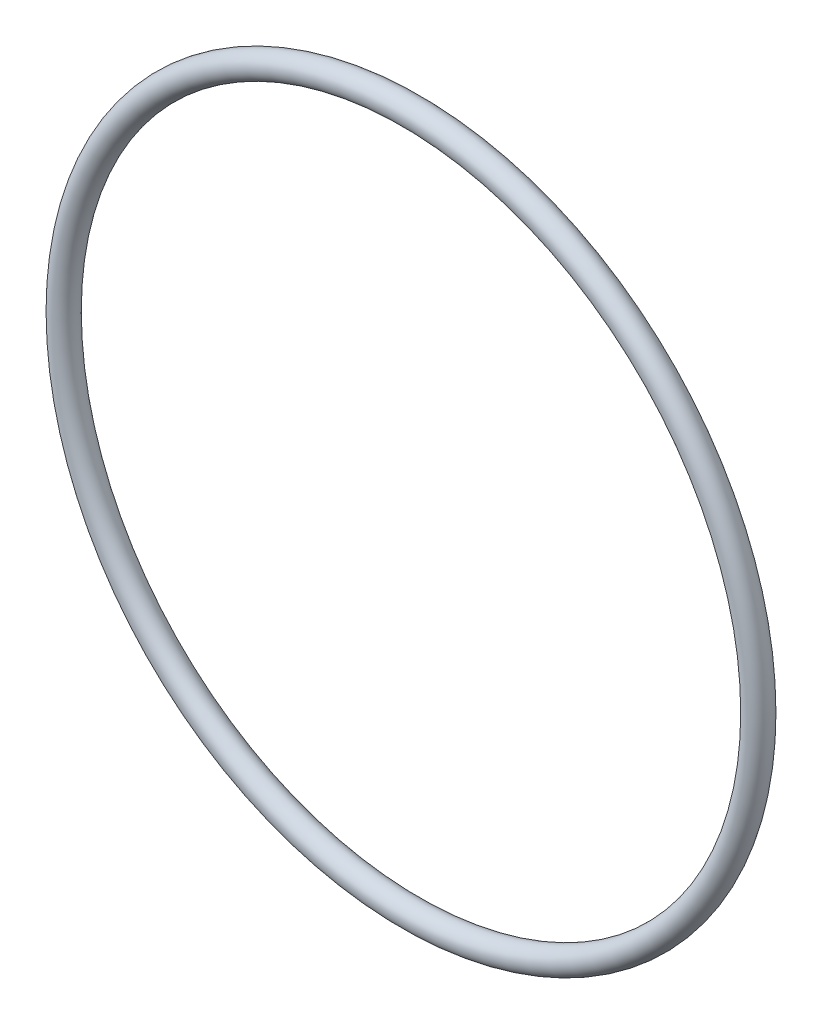
ISO-10303-21;
HEADER;
FILE_DESCRIPTION(('STEP AP214'),'2;1');
FILE_NAME('part.step','',(''),(''),'','','');
FILE_SCHEMA(('AUTOMOTIVE_DESIGN { 1 0 10303 214 1 1 1 1 }'));
ENDSEC;
DATA;
#1=APPLICATION_CONTEXT('core data for automotive mechanical design processes');
#2=APPLICATION_PROTOCOL_DEFINITION('international standard','automotive_design',2000,#1);
#3=PRODUCT_CONTEXT('',#1,'mechanical');
#4=PRODUCT('Part','Part','',(#3));
#5=PRODUCT_RELATED_PRODUCT_CATEGORY('part','',(#4));
#6=PRODUCT_DEFINITION_FORMATION('','',#4);
#7=PRODUCT_DEFINITION_CONTEXT('part definition',#1,'design');
#8=PRODUCT_DEFINITION('design','',#6,#7);
#9=PRODUCT_DEFINITION_SHAPE('','',#8);
#10=(LENGTH_UNIT() NAMED_UNIT(*) SI_UNIT(.MILLI.,.METRE.));
#11=(NAMED_UNIT(*) PLANE_ANGLE_UNIT() SI_UNIT($,.RADIAN.));
#12=(NAMED_UNIT(*) SI_UNIT($,.STERADIAN.) SOLID_ANGLE_UNIT());
#13=UNCERTAINTY_MEASURE_WITH_UNIT(LENGTH_MEASURE(1.E-05),#10,'distance_accuracy_value','');
#14=(GEOMETRIC_REPRESENTATION_CONTEXT(3) GLOBAL_UNCERTAINTY_ASSIGNED_CONTEXT((#13)) GLOBAL_UNIT_ASSIGNED_CONTEXT((#10,
#11,#12)) REPRESENTATION_CONTEXT('',''));
#15=CARTESIAN_POINT('',(0.,0.,0.));
#16=DIRECTION('',(0.,0.,1.));
#17=DIRECTION('',(1.,0.,0.));
#18=AXIS2_PLACEMENT_3D('',#15,#16,#17);
#19=CARTESIAN_POINT('',(0.,0.,0.));
#20=DIRECTION('',(0.,0.,1.));
#21=DIRECTION('',(1.,0.,0.));
#22=AXIS2_PLACEMENT_3D('',#19,#20,#21);
#23=TOROIDAL_SURFACE('',#22,49.1871,1.7653);
#24=CARTESIAN_POINT('',(50.9524,0.,0.));
#25=VERTEX_POINT('',#24);
#26=VERTEX_LOOP('',#25);
#27=FACE_BOUND('',#26,.T.);
#28=ADVANCED_FACE('F35',(#27),#23,.T.);
#29=CLOSED_SHELL('',(#28));
#30=MANIFOLD_SOLID_BREP('B2',#29);
#31=ADVANCED_BREP_SHAPE_REPRESENTATION('',(#18,#30),#14);
#32=SHAPE_DEFINITION_REPRESENTATION(#9,#31);
ENDSEC;
END-ISO-10303-21;
